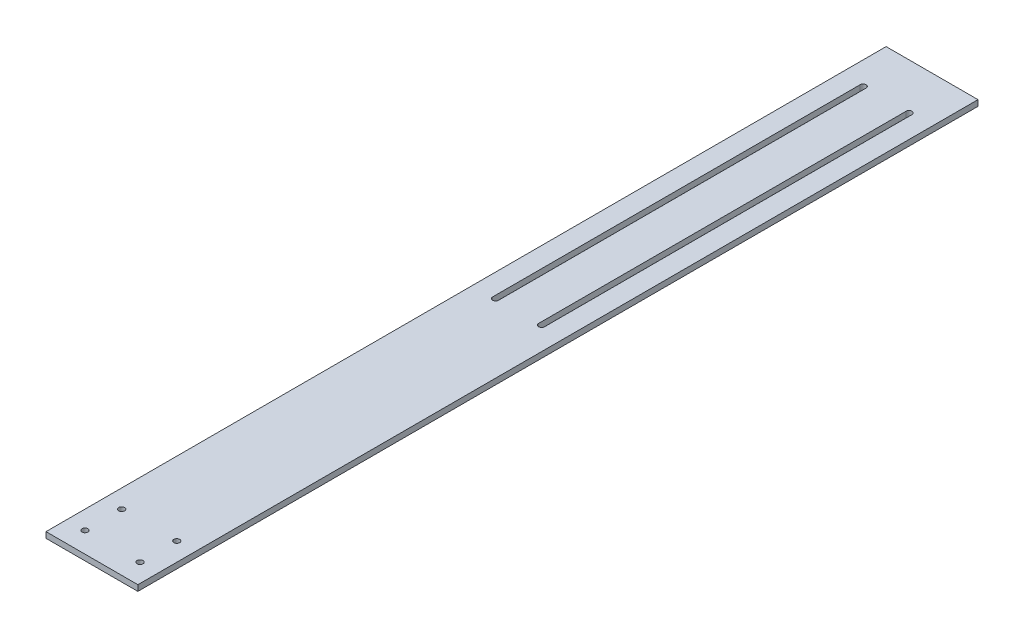
ISO-10303-21;
HEADER;
FILE_DESCRIPTION(('STEP AP214'),'2;1');
FILE_NAME('part.step','',(''),(''),'','','');
FILE_SCHEMA(('AUTOMOTIVE_DESIGN { 1 0 10303 214 1 1 1 1 }'));
ENDSEC;
DATA;
#1=APPLICATION_CONTEXT('core data for automotive mechanical design processes');
#2=APPLICATION_PROTOCOL_DEFINITION('international standard','automotive_design',2000,#1);
#3=PRODUCT_CONTEXT('',#1,'mechanical');
#4=PRODUCT('Part','Part','',(#3));
#5=PRODUCT_RELATED_PRODUCT_CATEGORY('part','',(#4));
#6=PRODUCT_DEFINITION_FORMATION('','',#4);
#7=PRODUCT_DEFINITION_CONTEXT('part definition',#1,'design');
#8=PRODUCT_DEFINITION('design','',#6,#7);
#9=PRODUCT_DEFINITION_SHAPE('','',#8);
#10=(LENGTH_UNIT() NAMED_UNIT(*) SI_UNIT(.MILLI.,.METRE.));
#11=(NAMED_UNIT(*) PLANE_ANGLE_UNIT() SI_UNIT($,.RADIAN.));
#12=(NAMED_UNIT(*) SI_UNIT($,.STERADIAN.) SOLID_ANGLE_UNIT());
#13=UNCERTAINTY_MEASURE_WITH_UNIT(LENGTH_MEASURE(1.E-05),#10,'distance_accuracy_value','');
#14=(GEOMETRIC_REPRESENTATION_CONTEXT(3) GLOBAL_UNCERTAINTY_ASSIGNED_CONTEXT((#13)) GLOBAL_UNIT_ASSIGNED_CONTEXT((#10,
#11,#12)) REPRESENTATION_CONTEXT('',''));
#15=CARTESIAN_POINT('',(0.,0.,0.));
#16=DIRECTION('',(0.,0.,1.));
#17=DIRECTION('',(1.,0.,0.));
#18=AXIS2_PLACEMENT_3D('',#15,#16,#17);
#19=CARTESIAN_POINT('',(-25.,3.175,-228.6));
#20=DIRECTION('',(0.,0.,-1.));
#21=DIRECTION('',(-1.,0.,0.));
#22=AXIS2_PLACEMENT_3D('',#19,#20,#21);
#23=PLANE('',#22);
#24=DIRECTION('',(1.,0.,0.));
#25=VECTOR('',#24,1.);
#26=CARTESIAN_POINT('',(-25.,0.,-228.6));
#27=LINE('',#26,#25);
#28=CARTESIAN_POINT('',(-25.,0.,-228.6));
#29=VERTEX_POINT('',#28);
#30=CARTESIAN_POINT('',(25.,0.,-228.6));
#31=VERTEX_POINT('',#30);
#32=EDGE_CURVE('E191',#29,#31,#27,.T.);
#33=ORIENTED_EDGE('',*,*,#32,.F.);
#34=DIRECTION('',(0.,-1.,0.));
#35=VECTOR('',#34,1.);
#36=CARTESIAN_POINT('',(-25.,3.175,-228.6));
#37=LINE('',#36,#35);
#38=CARTESIAN_POINT('',(-25.,3.175,-228.6));
#39=VERTEX_POINT('',#38);
#40=EDGE_CURVE('E11',#39,#29,#37,.T.);
#41=ORIENTED_EDGE('',*,*,#40,.F.);
#42=DIRECTION('',(1.,0.,0.));
#43=VECTOR('',#42,1.);
#44=CARTESIAN_POINT('',(-25.,3.175,-228.6));
#45=LINE('',#44,#43);
#46=CARTESIAN_POINT('',(25.,3.175,-228.6));
#47=VERTEX_POINT('',#46);
#48=EDGE_CURVE('E232',#39,#47,#45,.T.);
#49=ORIENTED_EDGE('',*,*,#48,.T.);
#50=DIRECTION('',(0.,-1.,0.));
#51=VECTOR('',#50,1.);
#52=CARTESIAN_POINT('',(25.,3.175,-228.6));
#53=LINE('',#52,#51);
#54=EDGE_CURVE('E44',#47,#31,#53,.T.);
#55=ORIENTED_EDGE('',*,*,#54,.T.);
#56=EDGE_LOOP('',(#33,#41,#49,#55));
#57=FACE_BOUND('',#56,.T.);
#58=ADVANCED_FACE('F41',(#57),#23,.T.);
#59=CARTESIAN_POINT('',(-25.,3.175,-228.6));
#60=DIRECTION('',(1.,0.,0.));
#61=DIRECTION('',(0.,0.,-1.));
#62=AXIS2_PLACEMENT_3D('',#59,#60,#61);
#63=PLANE('',#62);
#64=DIRECTION('',(0.,0.,1.));
#65=VECTOR('',#64,1.);
#66=CARTESIAN_POINT('',(-25.,0.,-228.6));
#67=LINE('',#66,#65);
#68=CARTESIAN_POINT('',(-25.,0.,228.6));
#69=VERTEX_POINT('',#68);
#70=EDGE_CURVE('E236',#29,#69,#67,.T.);
#71=ORIENTED_EDGE('',*,*,#70,.T.);
#72=DIRECTION('',(0.,-1.,0.));
#73=VECTOR('',#72,1.);
#74=CARTESIAN_POINT('',(-25.,3.175,228.6));
#75=LINE('',#74,#73);
#76=CARTESIAN_POINT('',(-25.,3.175,228.6));
#77=VERTEX_POINT('',#76);
#78=EDGE_CURVE('E49',#77,#69,#75,.T.);
#79=ORIENTED_EDGE('',*,*,#78,.F.);
#80=DIRECTION('',(0.,0.,1.));
#81=VECTOR('',#80,1.);
#82=CARTESIAN_POINT('',(-25.,3.175,-228.6));
#83=LINE('',#82,#81);
#84=EDGE_CURVE('E243',#39,#77,#83,.T.);
#85=ORIENTED_EDGE('',*,*,#84,.F.);
#86=ORIENTED_EDGE('',*,*,#40,.T.);
#87=EDGE_LOOP('',(#71,#79,#85,#86));
#88=FACE_BOUND('',#87,.T.);
#89=ADVANCED_FACE('F277',(#88),#63,.F.);
#90=CARTESIAN_POINT('',(-25.,3.175,228.6));
#91=DIRECTION('',(0.,0.,-1.));
#92=DIRECTION('',(-1.,0.,0.));
#93=AXIS2_PLACEMENT_3D('',#90,#91,#92);
#94=PLANE('',#93);
#95=DIRECTION('',(1.,0.,0.));
#96=VECTOR('',#95,1.);
#97=CARTESIAN_POINT('',(-25.,0.,228.6));
#98=LINE('',#97,#96);
#99=CARTESIAN_POINT('',(25.,0.,228.6));
#100=VERTEX_POINT('',#99);
#101=EDGE_CURVE('E252',#69,#100,#98,.T.);
#102=ORIENTED_EDGE('',*,*,#101,.T.);
#103=DIRECTION('',(0.,-1.,0.));
#104=VECTOR('',#103,1.);
#105=CARTESIAN_POINT('',(25.,3.175,228.6));
#106=LINE('',#105,#104);
#107=CARTESIAN_POINT('',(25.,3.175,228.6));
#108=VERTEX_POINT('',#107);
#109=EDGE_CURVE('E260',#108,#100,#106,.T.);
#110=ORIENTED_EDGE('',*,*,#109,.F.);
#111=DIRECTION('',(1.,0.,0.));
#112=VECTOR('',#111,1.);
#113=CARTESIAN_POINT('',(-25.,3.175,228.6));
#114=LINE('',#113,#112);
#115=EDGE_CURVE('E240',#77,#108,#114,.T.);
#116=ORIENTED_EDGE('',*,*,#115,.F.);
#117=ORIENTED_EDGE('',*,*,#78,.T.);
#118=EDGE_LOOP('',(#102,#110,#116,#117));
#119=FACE_BOUND('',#118,.T.);
#120=ADVANCED_FACE('F281',(#119),#94,.F.);
#121=CARTESIAN_POINT('',(25.,3.175,-228.6));
#122=DIRECTION('',(1.,0.,0.));
#123=DIRECTION('',(0.,0.,-1.));
#124=AXIS2_PLACEMENT_3D('',#121,#122,#123);
#125=PLANE('',#124);
#126=DIRECTION('',(0.,0.,1.));
#127=VECTOR('',#126,1.);
#128=CARTESIAN_POINT('',(25.,0.,-228.6));
#129=LINE('',#128,#127);
#130=EDGE_CURVE('E248',#31,#100,#129,.T.);
#131=ORIENTED_EDGE('',*,*,#130,.F.);
#132=ORIENTED_EDGE('',*,*,#54,.F.);
#133=DIRECTION('',(0.,0.,1.));
#134=VECTOR('',#133,1.);
#135=CARTESIAN_POINT('',(25.,3.175,-228.6));
#136=LINE('',#135,#134);
#137=EDGE_CURVE('E235',#47,#108,#136,.T.);
#138=ORIENTED_EDGE('',*,*,#137,.T.);
#139=ORIENTED_EDGE('',*,*,#109,.T.);
#140=EDGE_LOOP('',(#131,#132,#138,#139));
#141=FACE_BOUND('',#140,.T.);
#142=ADVANCED_FACE('F270',(#141),#125,.T.);
#143=CARTESIAN_POINT('',(0.,3.175,0.));
#144=DIRECTION('',(0.,-1.,0.));
#145=DIRECTION('',(0.,0.,-1.));
#146=AXIS2_PLACEMENT_3D('',#143,#144,#145);
#147=PLANE('',#146);
#148=CARTESIAN_POINT('',(-15.,3.175,217.425));
#149=DIRECTION('',(0.,-1.,0.));
#150=DIRECTION('',(0.,0.,-1.));
#151=AXIS2_PLACEMENT_3D('',#148,#149,#150);
#152=CIRCLE('',#151,1.6);
#153=CARTESIAN_POINT('',(-15.,3.175,215.825));
#154=VERTEX_POINT('',#153);
#155=EDGE_CURVE('E423',#154,#154,#152,.T.);
#156=ORIENTED_EDGE('',*,*,#155,.T.);
#157=EDGE_LOOP('',(#156));
#158=FACE_BOUND('',#157,.T.);
#159=CARTESIAN_POINT('',(15.,3.175,197.425));
#160=DIRECTION('',(0.,-1.,0.));
#161=DIRECTION('',(0.,0.,-1.));
#162=AXIS2_PLACEMENT_3D('',#159,#160,#161);
#163=CIRCLE('',#162,1.6);
#164=CARTESIAN_POINT('',(15.,3.175,195.825));
#165=VERTEX_POINT('',#164);
#166=EDGE_CURVE('E436',#165,#165,#163,.T.);
#167=ORIENTED_EDGE('',*,*,#166,.T.);
#168=EDGE_LOOP('',(#167));
#169=FACE_BOUND('',#168,.T.);
#170=CARTESIAN_POINT('',(15.,3.175,217.425));
#171=DIRECTION('',(0.,-1.,0.));
#172=DIRECTION('',(0.,0.,-1.));
#173=AXIS2_PLACEMENT_3D('',#170,#171,#172);
#174=CIRCLE('',#173,1.6);
#175=CARTESIAN_POINT('',(15.,3.175,215.825));
#176=VERTEX_POINT('',#175);
#177=EDGE_CURVE('E444',#176,#176,#174,.T.);
#178=ORIENTED_EDGE('',*,*,#177,.T.);
#179=EDGE_LOOP('',(#178));
#180=FACE_BOUND('',#179,.T.);
#181=CARTESIAN_POINT('',(-15.,3.175,197.425));
#182=DIRECTION('',(0.,-1.,0.));
#183=DIRECTION('',(0.,0.,-1.));
#184=AXIS2_PLACEMENT_3D('',#181,#182,#183);
#185=CIRCLE('',#184,1.6);
#186=CARTESIAN_POINT('',(-15.,3.175,195.825));
#187=VERTEX_POINT('',#186);
#188=EDGE_CURVE('E176',#187,#187,#185,.T.);
#189=ORIENTED_EDGE('',*,*,#188,.T.);
#190=EDGE_LOOP('',(#189));
#191=FACE_BOUND('',#190,.T.);
#192=DIRECTION('',(0.,0.,1.));
#193=VECTOR('',#192,1.);
#194=CARTESIAN_POINT('',(-10.8999999999999,3.175,-3.59999999999999));
#195=LINE('',#194,#193);
#196=CARTESIAN_POINT('',(-10.8999999999999,3.175,-203.6));
#197=VERTEX_POINT('',#196);
#198=CARTESIAN_POINT('',(-10.8999999999999,3.175,-3.59999999999999));
#199=VERTEX_POINT('',#198);
#200=EDGE_CURVE('E155',#197,#199,#195,.T.);
#201=ORIENTED_EDGE('',*,*,#200,.T.);
#202=CARTESIAN_POINT('',(-12.5,3.175,-3.59999999999999));
#203=DIRECTION('',(0.,-1.,0.));
#204=DIRECTION('',(0.,0.,-1.));
#205=AXIS2_PLACEMENT_3D('',#202,#203,#204);
#206=CIRCLE('',#205,1.60000000000013);
#207=CARTESIAN_POINT('',(-14.1000000000002,3.175,-3.59999999999999));
#208=VERTEX_POINT('',#207);
#209=EDGE_CURVE('E146',#199,#208,#206,.T.);
#210=ORIENTED_EDGE('',*,*,#209,.T.);
#211=DIRECTION('',(0.,0.,-1.));
#212=VECTOR('',#211,1.);
#213=CARTESIAN_POINT('',(-14.1000000000002,3.175,-3.59999999999999));
#214=LINE('',#213,#212);
#215=CARTESIAN_POINT('',(-14.1000000000001,3.175,-203.6));
#216=VERTEX_POINT('',#215);
#217=EDGE_CURVE('E158',#208,#216,#214,.T.);
#218=ORIENTED_EDGE('',*,*,#217,.T.);
#219=CARTESIAN_POINT('',(-12.5,3.175,-203.6));
#220=DIRECTION('',(0.,-1.,0.));
#221=DIRECTION('',(0.,0.,-1.));
#222=AXIS2_PLACEMENT_3D('',#219,#220,#221);
#223=CIRCLE('',#222,1.60000000000013);
#224=EDGE_CURVE('E57',#216,#197,#223,.T.);
#225=ORIENTED_EDGE('',*,*,#224,.T.);
#226=EDGE_LOOP('',(#201,#210,#218,#225));
#227=FACE_BOUND('',#226,.T.);
#228=DIRECTION('',(0.,0.,1.));
#229=VECTOR('',#228,1.);
#230=CARTESIAN_POINT('',(14.1000000000001,3.175,-3.59999999999999));
#231=LINE('',#230,#229);
#232=CARTESIAN_POINT('',(14.1000000000002,3.175,-203.6));
#233=VERTEX_POINT('',#232);
#234=CARTESIAN_POINT('',(14.1000000000001,3.175,-3.59999999999999));
#235=VERTEX_POINT('',#234);
#236=EDGE_CURVE('E205',#233,#235,#231,.T.);
#237=ORIENTED_EDGE('',*,*,#236,.T.);
#238=CARTESIAN_POINT('',(12.5,3.175,-3.59999999999999));
#239=DIRECTION('',(0.,-1.,0.));
#240=DIRECTION('',(0.,0.,1.));
#241=AXIS2_PLACEMENT_3D('',#238,#239,#240);
#242=CIRCLE('',#241,1.6000000000001);
#243=CARTESIAN_POINT('',(10.8999999999999,3.175,-3.59999999999999));
#244=VERTEX_POINT('',#243);
#245=EDGE_CURVE('E195',#235,#244,#242,.T.);
#246=ORIENTED_EDGE('',*,*,#245,.T.);
#247=DIRECTION('',(0.,0.,-1.));
#248=VECTOR('',#247,1.);
#249=CARTESIAN_POINT('',(10.8999999999999,3.175,-3.59999999999999));
#250=LINE('',#249,#248);
#251=CARTESIAN_POINT('',(10.8999999999999,3.175,-203.6));
#252=VERTEX_POINT('',#251);
#253=EDGE_CURVE('E199',#244,#252,#250,.T.);
#254=ORIENTED_EDGE('',*,*,#253,.T.);
#255=CARTESIAN_POINT('',(12.5000000000001,3.175,-203.6));
#256=DIRECTION('',(0.,-1.,0.));
#257=DIRECTION('',(0.,0.,1.));
#258=AXIS2_PLACEMENT_3D('',#255,#256,#257);
#259=CIRCLE('',#258,1.6000000000001);
#260=EDGE_CURVE('E65',#252,#233,#259,.T.);
#261=ORIENTED_EDGE('',*,*,#260,.T.);
#262=EDGE_LOOP('',(#237,#246,#254,#261));
#263=FACE_BOUND('',#262,.T.);
#264=ORIENTED_EDGE('',*,*,#48,.F.);
#265=ORIENTED_EDGE('',*,*,#84,.T.);
#266=ORIENTED_EDGE('',*,*,#115,.T.);
#267=ORIENTED_EDGE('',*,*,#137,.F.);
#268=EDGE_LOOP('',(#264,#265,#266,#267));
#269=FACE_BOUND('',#268,.T.);
#270=ADVANCED_FACE('F163',(#158,#169,#180,#191,#227,#263,#269),#147,.F.);
#271=CARTESIAN_POINT('',(0.,0.,0.));
#272=DIRECTION('',(0.,-1.,0.));
#273=DIRECTION('',(0.,0.,-1.));
#274=AXIS2_PLACEMENT_3D('',#271,#272,#273);
#275=PLANE('',#274);
#276=CARTESIAN_POINT('',(-15.,0.,217.425));
#277=DIRECTION('',(0.,-1.,0.));
#278=DIRECTION('',(0.,0.,-1.));
#279=AXIS2_PLACEMENT_3D('',#276,#277,#278);
#280=CIRCLE('',#279,1.59999999999999);
#281=CARTESIAN_POINT('',(-15.,0.,215.825));
#282=VERTEX_POINT('',#281);
#283=EDGE_CURVE('E426',#282,#282,#280,.T.);
#284=ORIENTED_EDGE('',*,*,#283,.F.);
#285=EDGE_LOOP('',(#284));
#286=FACE_BOUND('',#285,.T.);
#287=CARTESIAN_POINT('',(15.,0.,197.425));
#288=DIRECTION('',(0.,-1.,0.));
#289=DIRECTION('',(0.,0.,-1.));
#290=AXIS2_PLACEMENT_3D('',#287,#288,#289);
#291=CIRCLE('',#290,1.59999999999999);
#292=CARTESIAN_POINT('',(15.,0.,195.825));
#293=VERTEX_POINT('',#292);
#294=EDGE_CURVE('E430',#293,#293,#291,.T.);
#295=ORIENTED_EDGE('',*,*,#294,.F.);
#296=EDGE_LOOP('',(#295));
#297=FACE_BOUND('',#296,.T.);
#298=CARTESIAN_POINT('',(15.,0.,217.425));
#299=DIRECTION('',(0.,-1.,0.));
#300=DIRECTION('',(0.,0.,-1.));
#301=AXIS2_PLACEMENT_3D('',#298,#299,#300);
#302=CIRCLE('',#301,1.59999999999999);
#303=CARTESIAN_POINT('',(15.,0.,215.825));
#304=VERTEX_POINT('',#303);
#305=EDGE_CURVE('E440',#304,#304,#302,.T.);
#306=ORIENTED_EDGE('',*,*,#305,.F.);
#307=EDGE_LOOP('',(#306));
#308=FACE_BOUND('',#307,.T.);
#309=CARTESIAN_POINT('',(-15.,0.,197.425));
#310=DIRECTION('',(0.,-1.,0.));
#311=DIRECTION('',(0.,0.,-1.));
#312=AXIS2_PLACEMENT_3D('',#309,#310,#311);
#313=CIRCLE('',#312,1.59999999999999);
#314=CARTESIAN_POINT('',(-15.,0.,195.825));
#315=VERTEX_POINT('',#314);
#316=EDGE_CURVE('E446',#315,#315,#313,.T.);
#317=ORIENTED_EDGE('',*,*,#316,.F.);
#318=EDGE_LOOP('',(#317));
#319=FACE_BOUND('',#318,.T.);
#320=CARTESIAN_POINT('',(-12.5,0.,-3.59999999999999));
#321=DIRECTION('',(0.,-1.,0.));
#322=DIRECTION('',(0.,0.,-1.));
#323=AXIS2_PLACEMENT_3D('',#320,#321,#322);
#324=CIRCLE('',#323,1.60000000000013);
#325=CARTESIAN_POINT('',(-10.8999999999999,0.,-3.59999999999999));
#326=VERTEX_POINT('',#325);
#327=CARTESIAN_POINT('',(-14.1000000000002,0.,-3.59999999999999));
#328=VERTEX_POINT('',#327);
#329=EDGE_CURVE('E149',#326,#328,#324,.T.);
#330=ORIENTED_EDGE('',*,*,#329,.F.);
#331=DIRECTION('',(0.,0.,1.));
#332=VECTOR('',#331,1.);
#333=CARTESIAN_POINT('',(-10.8999999999999,0.,-3.59999999999999));
#334=LINE('',#333,#332);
#335=CARTESIAN_POINT('',(-10.8999999999999,0.,-203.6));
#336=VERTEX_POINT('',#335);
#337=EDGE_CURVE('E167',#336,#326,#334,.T.);
#338=ORIENTED_EDGE('',*,*,#337,.F.);
#339=CARTESIAN_POINT('',(-12.5,0.,-203.6));
#340=DIRECTION('',(0.,-1.,0.));
#341=DIRECTION('',(0.,0.,-1.));
#342=AXIS2_PLACEMENT_3D('',#339,#340,#341);
#343=CIRCLE('',#342,1.60000000000013);
#344=CARTESIAN_POINT('',(-14.1000000000001,0.,-203.6));
#345=VERTEX_POINT('',#344);
#346=EDGE_CURVE('E173',#345,#336,#343,.T.);
#347=ORIENTED_EDGE('',*,*,#346,.F.);
#348=DIRECTION('',(0.,0.,-1.));
#349=VECTOR('',#348,1.);
#350=CARTESIAN_POINT('',(-14.1000000000002,0.,-3.59999999999999));
#351=LINE('',#350,#349);
#352=EDGE_CURVE('E183',#328,#345,#351,.T.);
#353=ORIENTED_EDGE('',*,*,#352,.F.);
#354=EDGE_LOOP('',(#330,#338,#347,#353));
#355=FACE_BOUND('',#354,.T.);
#356=CARTESIAN_POINT('',(12.5,0.,-3.59999999999999));
#357=DIRECTION('',(0.,-1.,0.));
#358=DIRECTION('',(0.,0.,1.));
#359=AXIS2_PLACEMENT_3D('',#356,#357,#358);
#360=CIRCLE('',#359,1.6000000000001);
#361=CARTESIAN_POINT('',(14.1000000000001,0.,-3.59999999999999));
#362=VERTEX_POINT('',#361);
#363=CARTESIAN_POINT('',(10.8999999999999,0.,-3.59999999999999));
#364=VERTEX_POINT('',#363);
#365=EDGE_CURVE('E210',#362,#364,#360,.T.);
#366=ORIENTED_EDGE('',*,*,#365,.F.);
#367=DIRECTION('',(0.,0.,1.));
#368=VECTOR('',#367,1.);
#369=CARTESIAN_POINT('',(14.1000000000001,0.,-3.59999999999999));
#370=LINE('',#369,#368);
#371=CARTESIAN_POINT('',(14.1000000000002,0.,-203.6));
#372=VERTEX_POINT('',#371);
#373=EDGE_CURVE('E200',#372,#362,#370,.T.);
#374=ORIENTED_EDGE('',*,*,#373,.F.);
#375=CARTESIAN_POINT('',(12.5000000000001,0.,-203.6));
#376=DIRECTION('',(0.,-1.,0.));
#377=DIRECTION('',(0.,0.,1.));
#378=AXIS2_PLACEMENT_3D('',#375,#376,#377);
#379=CIRCLE('',#378,1.6000000000001);
#380=CARTESIAN_POINT('',(10.8999999999999,0.,-203.6));
#381=VERTEX_POINT('',#380);
#382=EDGE_CURVE('E217',#381,#372,#379,.T.);
#383=ORIENTED_EDGE('',*,*,#382,.F.);
#384=DIRECTION('',(0.,0.,-1.));
#385=VECTOR('',#384,1.);
#386=CARTESIAN_POINT('',(10.8999999999999,0.,-3.59999999999999));
#387=LINE('',#386,#385);
#388=EDGE_CURVE('E213',#364,#381,#387,.T.);
#389=ORIENTED_EDGE('',*,*,#388,.F.);
#390=EDGE_LOOP('',(#366,#374,#383,#389));
#391=FACE_BOUND('',#390,.T.);
#392=ORIENTED_EDGE('',*,*,#32,.T.);
#393=ORIENTED_EDGE('',*,*,#130,.T.);
#394=ORIENTED_EDGE('',*,*,#101,.F.);
#395=ORIENTED_EDGE('',*,*,#70,.F.);
#396=EDGE_LOOP('',(#392,#393,#394,#395));
#397=FACE_BOUND('',#396,.T.);
#398=ADVANCED_FACE('F274',(#286,#297,#308,#319,#355,#391,#397),#275,.T.);
#399=CARTESIAN_POINT('',(12.5,3.175,-3.59999999999999));
#400=DIRECTION('',(0.,-1.,0.));
#401=DIRECTION('',(0.,0.,-1.));
#402=AXIS2_PLACEMENT_3D('',#399,#400,#401);
#403=CYLINDRICAL_SURFACE('',#402,1.6000000000001);
#404=ORIENTED_EDGE('',*,*,#365,.T.);
#405=DIRECTION('',(0.,-1.,0.));
#406=VECTOR('',#405,1.);
#407=CARTESIAN_POINT('',(10.8999999999999,3.175,-3.59999999999999));
#408=LINE('',#407,#406);
#409=EDGE_CURVE('E209',#244,#364,#408,.T.);
#410=ORIENTED_EDGE('',*,*,#409,.F.);
#411=ORIENTED_EDGE('',*,*,#245,.F.);
#412=DIRECTION('',(0.,-1.,0.));
#413=VECTOR('',#412,1.);
#414=CARTESIAN_POINT('',(14.1000000000001,3.175,-3.59999999999999));
#415=LINE('',#414,#413);
#416=EDGE_CURVE('E184',#235,#362,#415,.T.);
#417=ORIENTED_EDGE('',*,*,#416,.T.);
#418=EDGE_LOOP('',(#404,#410,#411,#417));
#419=FACE_BOUND('',#418,.T.);
#420=ADVANCED_FACE('F290',(#419),#403,.F.);
#421=CARTESIAN_POINT('',(14.1000000000001,3.175,-3.59999999999999));
#422=DIRECTION('',(1.,0.,0.));
#423=DIRECTION('',(0.,0.,-1.));
#424=AXIS2_PLACEMENT_3D('',#421,#422,#423);
#425=PLANE('',#424);
#426=ORIENTED_EDGE('',*,*,#373,.T.);
#427=ORIENTED_EDGE('',*,*,#416,.F.);
#428=ORIENTED_EDGE('',*,*,#236,.F.);
#429=DIRECTION('',(0.,-1.,0.));
#430=VECTOR('',#429,1.);
#431=CARTESIAN_POINT('',(14.1000000000002,3.175,-203.6));
#432=LINE('',#431,#430);
#433=EDGE_CURVE('E225',#233,#372,#432,.T.);
#434=ORIENTED_EDGE('',*,*,#433,.T.);
#435=EDGE_LOOP('',(#426,#427,#428,#434));
#436=FACE_BOUND('',#435,.T.);
#437=ADVANCED_FACE('F384',(#436),#425,.F.);
#438=CARTESIAN_POINT('',(12.5000000000001,3.175,-203.6));
#439=DIRECTION('',(0.,-1.,0.));
#440=DIRECTION('',(0.,0.,-1.));
#441=AXIS2_PLACEMENT_3D('',#438,#439,#440);
#442=CYLINDRICAL_SURFACE('',#441,1.6000000000001);
#443=ORIENTED_EDGE('',*,*,#382,.T.);
#444=ORIENTED_EDGE('',*,*,#433,.F.);
#445=ORIENTED_EDGE('',*,*,#260,.F.);
#446=DIRECTION('',(0.,-1.,0.));
#447=VECTOR('',#446,1.);
#448=CARTESIAN_POINT('',(10.8999999999999,3.175,-203.6));
#449=LINE('',#448,#447);
#450=EDGE_CURVE('E227',#252,#381,#449,.T.);
#451=ORIENTED_EDGE('',*,*,#450,.T.);
#452=EDGE_LOOP('',(#443,#444,#445,#451));
#453=FACE_BOUND('',#452,.T.);
#454=ADVANCED_FACE('F374',(#453),#442,.F.);
#455=CARTESIAN_POINT('',(10.8999999999999,3.175,-3.59999999999999));
#456=DIRECTION('',(-1.,0.,0.));
#457=DIRECTION('',(0.,0.,1.));
#458=AXIS2_PLACEMENT_3D('',#455,#456,#457);
#459=PLANE('',#458);
#460=ORIENTED_EDGE('',*,*,#388,.T.);
#461=ORIENTED_EDGE('',*,*,#450,.F.);
#462=ORIENTED_EDGE('',*,*,#253,.F.);
#463=ORIENTED_EDGE('',*,*,#409,.T.);
#464=EDGE_LOOP('',(#460,#461,#462,#463));
#465=FACE_BOUND('',#464,.T.);
#466=ADVANCED_FACE('F365',(#465),#459,.F.);
#467=CARTESIAN_POINT('',(-12.5,3.175,-3.59999999999999));
#468=DIRECTION('',(0.,-1.,0.));
#469=DIRECTION('',(0.,0.,-1.));
#470=AXIS2_PLACEMENT_3D('',#467,#468,#469);
#471=CYLINDRICAL_SURFACE('',#470,1.60000000000013);
#472=ORIENTED_EDGE('',*,*,#329,.T.);
#473=DIRECTION('',(0.,-1.,0.));
#474=VECTOR('',#473,1.);
#475=CARTESIAN_POINT('',(-14.1000000000002,3.175,-3.59999999999999));
#476=LINE('',#475,#474);
#477=EDGE_CURVE('E142',#208,#328,#476,.T.);
#478=ORIENTED_EDGE('',*,*,#477,.F.);
#479=ORIENTED_EDGE('',*,*,#209,.F.);
#480=DIRECTION('',(0.,-1.,0.));
#481=VECTOR('',#480,1.);
#482=CARTESIAN_POINT('',(-10.8999999999999,3.175,-3.59999999999999));
#483=LINE('',#482,#481);
#484=EDGE_CURVE('E188',#199,#326,#483,.T.);
#485=ORIENTED_EDGE('',*,*,#484,.T.);
#486=EDGE_LOOP('',(#472,#478,#479,#485));
#487=FACE_BOUND('',#486,.T.);
#488=ADVANCED_FACE('F144',(#487),#471,.F.);
#489=CARTESIAN_POINT('',(-10.8999999999999,3.175,-3.59999999999999));
#490=DIRECTION('',(1.,0.,0.));
#491=DIRECTION('',(0.,0.,-1.));
#492=AXIS2_PLACEMENT_3D('',#489,#490,#491);
#493=PLANE('',#492);
#494=ORIENTED_EDGE('',*,*,#337,.T.);
#495=ORIENTED_EDGE('',*,*,#484,.F.);
#496=ORIENTED_EDGE('',*,*,#200,.F.);
#497=DIRECTION('',(0.,-1.,0.));
#498=VECTOR('',#497,1.);
#499=CARTESIAN_POINT('',(-10.8999999999999,3.175,-203.6));
#500=LINE('',#499,#498);
#501=EDGE_CURVE('E192',#197,#336,#500,.T.);
#502=ORIENTED_EDGE('',*,*,#501,.T.);
#503=EDGE_LOOP('',(#494,#495,#496,#502));
#504=FACE_BOUND('',#503,.T.);
#505=ADVANCED_FACE('F347',(#504),#493,.F.);
#506=CARTESIAN_POINT('',(-12.5,3.175,-203.6));
#507=DIRECTION('',(0.,-1.,0.));
#508=DIRECTION('',(0.,0.,-1.));
#509=AXIS2_PLACEMENT_3D('',#506,#507,#508);
#510=CYLINDRICAL_SURFACE('',#509,1.60000000000013);
#511=ORIENTED_EDGE('',*,*,#346,.T.);
#512=ORIENTED_EDGE('',*,*,#501,.F.);
#513=ORIENTED_EDGE('',*,*,#224,.F.);
#514=DIRECTION('',(0.,-1.,0.));
#515=VECTOR('',#514,1.);
#516=CARTESIAN_POINT('',(-14.1000000000001,3.175,-203.6));
#517=LINE('',#516,#515);
#518=EDGE_CURVE('E154',#216,#345,#517,.T.);
#519=ORIENTED_EDGE('',*,*,#518,.T.);
#520=EDGE_LOOP('',(#511,#512,#513,#519));
#521=FACE_BOUND('',#520,.T.);
#522=ADVANCED_FACE('F336',(#521),#510,.F.);
#523=CARTESIAN_POINT('',(-14.1000000000002,3.175,-3.59999999999999));
#524=DIRECTION('',(-1.,0.,0.));
#525=DIRECTION('',(0.,0.,1.));
#526=AXIS2_PLACEMENT_3D('',#523,#524,#525);
#527=PLANE('',#526);
#528=ORIENTED_EDGE('',*,*,#352,.T.);
#529=ORIENTED_EDGE('',*,*,#518,.F.);
#530=ORIENTED_EDGE('',*,*,#217,.F.);
#531=ORIENTED_EDGE('',*,*,#477,.T.);
#532=EDGE_LOOP('',(#528,#529,#530,#531));
#533=FACE_BOUND('',#532,.T.);
#534=ADVANCED_FACE('F159',(#533),#527,.F.);
#535=CARTESIAN_POINT('',(-15.,0.,197.425));
#536=DIRECTION('',(0.,-1.,0.));
#537=DIRECTION('',(0.,0.,-1.));
#538=AXIS2_PLACEMENT_3D('',#535,#536,#537);
#539=CYLINDRICAL_SURFACE('',#538,1.59999999999999);
#540=ORIENTED_EDGE('',*,*,#188,.F.);
#541=EDGE_LOOP('',(#540));
#542=FACE_BOUND('',#541,.T.);
#543=ORIENTED_EDGE('',*,*,#316,.T.);
#544=EDGE_LOOP('',(#543));
#545=FACE_BOUND('',#544,.T.);
#546=ADVANCED_FACE('F335',(#542,#545),#539,.F.);
#547=CARTESIAN_POINT('',(15.,0.,217.425));
#548=DIRECTION('',(0.,-1.,0.));
#549=DIRECTION('',(0.,0.,-1.));
#550=AXIS2_PLACEMENT_3D('',#547,#548,#549);
#551=CYLINDRICAL_SURFACE('',#550,1.59999999999999);
#552=ORIENTED_EDGE('',*,*,#177,.F.);
#553=EDGE_LOOP('',(#552));
#554=FACE_BOUND('',#553,.T.);
#555=ORIENTED_EDGE('',*,*,#305,.T.);
#556=EDGE_LOOP('',(#555));
#557=FACE_BOUND('',#556,.T.);
#558=ADVANCED_FACE('F407',(#554,#557),#551,.F.);
#559=CARTESIAN_POINT('',(15.,0.,197.425));
#560=DIRECTION('',(0.,-1.,0.));
#561=DIRECTION('',(0.,0.,-1.));
#562=AXIS2_PLACEMENT_3D('',#559,#560,#561);
#563=CYLINDRICAL_SURFACE('',#562,1.59999999999999);
#564=ORIENTED_EDGE('',*,*,#166,.F.);
#565=EDGE_LOOP('',(#564));
#566=FACE_BOUND('',#565,.T.);
#567=ORIENTED_EDGE('',*,*,#294,.T.);
#568=EDGE_LOOP('',(#567));
#569=FACE_BOUND('',#568,.T.);
#570=ADVANCED_FACE('F411',(#566,#569),#563,.F.);
#571=CARTESIAN_POINT('',(-15.,0.,217.425));
#572=DIRECTION('',(0.,-1.,0.));
#573=DIRECTION('',(0.,0.,-1.));
#574=AXIS2_PLACEMENT_3D('',#571,#572,#573);
#575=CYLINDRICAL_SURFACE('',#574,1.59999999999999);
#576=ORIENTED_EDGE('',*,*,#155,.F.);
#577=EDGE_LOOP('',(#576));
#578=FACE_BOUND('',#577,.T.);
#579=ORIENTED_EDGE('',*,*,#283,.T.);
#580=EDGE_LOOP('',(#579));
#581=FACE_BOUND('',#580,.T.);
#582=ADVANCED_FACE('F415',(#578,#581),#575,.F.);
#583=CLOSED_SHELL('',(#58,#89,#120,#142,#270,#398,#420,#437,#454,#466,#488,#505,#522,#534,#546,
#558,#570,#582));
#584=MANIFOLD_SOLID_BREP('B2',#583);
#585=ADVANCED_BREP_SHAPE_REPRESENTATION('',(#18,#584),#14);
#586=SHAPE_DEFINITION_REPRESENTATION(#9,#585);
ENDSEC;
END-ISO-10303-21;
